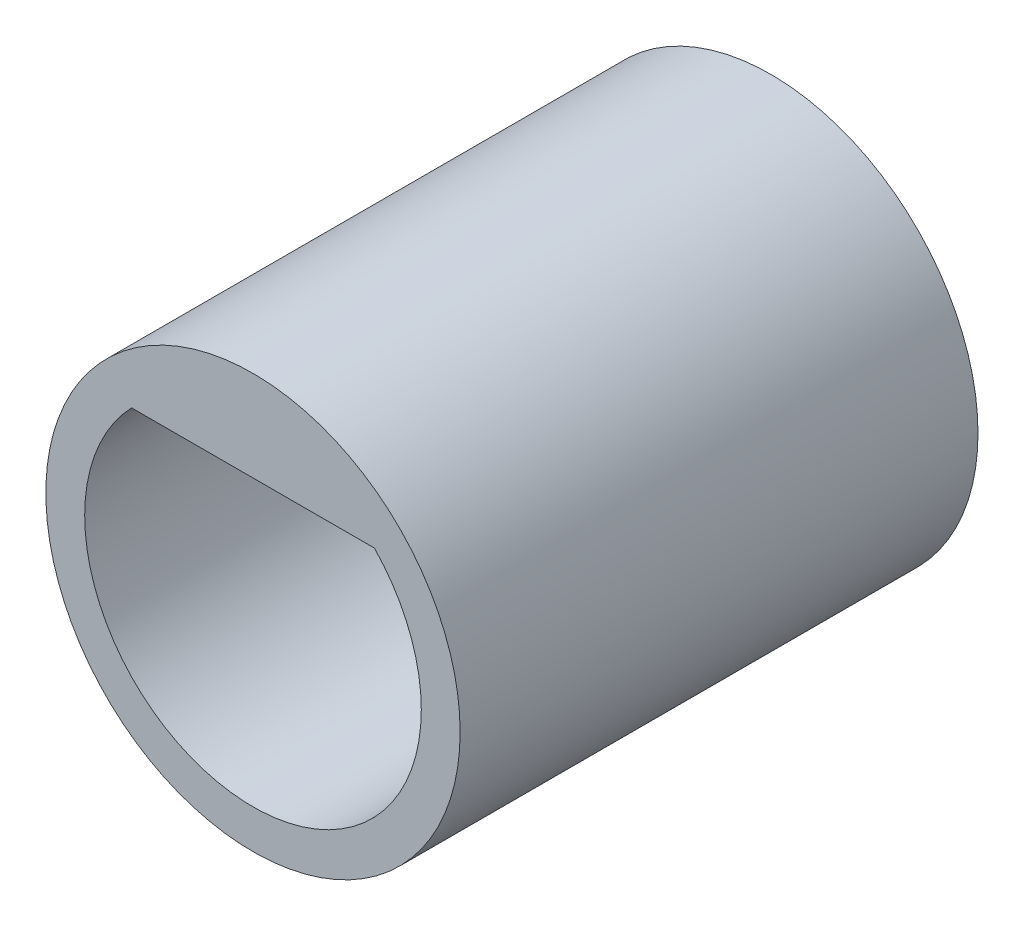
ISO-10303-21;
HEADER;
FILE_DESCRIPTION(('STEP AP214'),'2;1');
FILE_NAME('part.step','',(''),(''),'','','');
FILE_SCHEMA(('AUTOMOTIVE_DESIGN { 1 0 10303 214 1 1 1 1 }'));
ENDSEC;
DATA;
#1=APPLICATION_CONTEXT('core data for automotive mechanical design processes');
#2=APPLICATION_PROTOCOL_DEFINITION('international standard','automotive_design',2000,#1);
#3=PRODUCT_CONTEXT('',#1,'mechanical');
#4=PRODUCT('Part','Part','',(#3));
#5=PRODUCT_RELATED_PRODUCT_CATEGORY('part','',(#4));
#6=PRODUCT_DEFINITION_FORMATION('','',#4);
#7=PRODUCT_DEFINITION_CONTEXT('part definition',#1,'design');
#8=PRODUCT_DEFINITION('design','',#6,#7);
#9=PRODUCT_DEFINITION_SHAPE('','',#8);
#10=(LENGTH_UNIT() NAMED_UNIT(*) SI_UNIT(.MILLI.,.METRE.));
#11=(NAMED_UNIT(*) PLANE_ANGLE_UNIT() SI_UNIT($,.RADIAN.));
#12=(NAMED_UNIT(*) SI_UNIT($,.STERADIAN.) SOLID_ANGLE_UNIT());
#13=UNCERTAINTY_MEASURE_WITH_UNIT(LENGTH_MEASURE(1.E-05),#10,'distance_accuracy_value','');
#14=(GEOMETRIC_REPRESENTATION_CONTEXT(3) GLOBAL_UNCERTAINTY_ASSIGNED_CONTEXT((#13)) GLOBAL_UNIT_ASSIGNED_CONTEXT((#10,
#11,#12)) REPRESENTATION_CONTEXT('',''));
#15=CARTESIAN_POINT('',(0.,0.,0.));
#16=DIRECTION('',(0.,0.,1.));
#17=DIRECTION('',(1.,0.,0.));
#18=AXIS2_PLACEMENT_3D('',#15,#16,#17);
#19=CARTESIAN_POINT('',(0.,1.125,5.));
#20=DIRECTION('',(0.,1.,0.));
#21=DIRECTION('',(0.,0.,1.));
#22=AXIS2_PLACEMENT_3D('',#19,#20,#21);
#23=PLANE('',#22);
#24=DIRECTION('',(1.,0.,0.));
#25=VECTOR('',#24,1.);
#26=CARTESIAN_POINT('',(0.,1.125,0.));
#27=LINE('',#26,#25);
#28=CARTESIAN_POINT('',(-1.17260393995586,1.125,0.));
#29=VERTEX_POINT('',#28);
#30=CARTESIAN_POINT('',(1.17260393995586,1.125,0.));
#31=VERTEX_POINT('',#30);
#32=EDGE_CURVE('E60',#29,#31,#27,.T.);
#33=ORIENTED_EDGE('',*,*,#32,.T.);
#34=DIRECTION('',(0.,0.,-1.));
#35=VECTOR('',#34,1.);
#36=CARTESIAN_POINT('',(1.17260393995586,1.125,5.));
#37=LINE('',#36,#35);
#38=CARTESIAN_POINT('',(1.17260393995586,1.125,5.));
#39=VERTEX_POINT('',#38);
#40=EDGE_CURVE('E11',#39,#31,#37,.T.);
#41=ORIENTED_EDGE('',*,*,#40,.F.);
#42=DIRECTION('',(1.,0.,0.));
#43=VECTOR('',#42,1.);
#44=CARTESIAN_POINT('',(0.,1.125,5.));
#45=LINE('',#44,#43);
#46=CARTESIAN_POINT('',(-1.17260393995586,1.125,5.));
#47=VERTEX_POINT('',#46);
#48=EDGE_CURVE('E62',#47,#39,#45,.T.);
#49=ORIENTED_EDGE('',*,*,#48,.F.);
#50=DIRECTION('',(0.,0.,-1.));
#51=VECTOR('',#50,1.);
#52=CARTESIAN_POINT('',(-1.17260393995586,1.125,5.));
#53=LINE('',#52,#51);
#54=EDGE_CURVE('E44',#47,#29,#53,.T.);
#55=ORIENTED_EDGE('',*,*,#54,.T.);
#56=EDGE_LOOP('',(#33,#41,#49,#55));
#57=FACE_BOUND('',#56,.T.);
#58=ADVANCED_FACE('F36',(#57),#23,.F.);
#59=CARTESIAN_POINT('',(0.,0.,5.));
#60=DIRECTION('',(0.,0.,-1.));
#61=DIRECTION('',(-1.,0.,0.));
#62=AXIS2_PLACEMENT_3D('',#59,#60,#61);
#63=CYLINDRICAL_SURFACE('',#62,1.625);
#64=CARTESIAN_POINT('',(0.,0.,0.));
#65=DIRECTION('',(0.,0.,1.));
#66=DIRECTION('',(1.,0.,0.));
#67=AXIS2_PLACEMENT_3D('',#64,#65,#66);
#68=CIRCLE('',#67,1.625);
#69=EDGE_CURVE('E68',#29,#31,#68,.T.);
#70=ORIENTED_EDGE('',*,*,#69,.F.);
#71=ORIENTED_EDGE('',*,*,#54,.F.);
#72=CARTESIAN_POINT('',(0.,0.,5.));
#73=DIRECTION('',(0.,0.,1.));
#74=DIRECTION('',(1.,0.,0.));
#75=AXIS2_PLACEMENT_3D('',#72,#73,#74);
#76=CIRCLE('',#75,1.625);
#77=EDGE_CURVE('E78',#47,#39,#76,.T.);
#78=ORIENTED_EDGE('',*,*,#77,.T.);
#79=ORIENTED_EDGE('',*,*,#40,.T.);
#80=EDGE_LOOP('',(#70,#71,#78,#79));
#81=FACE_BOUND('',#80,.T.);
#82=ADVANCED_FACE('F70',(#81),#63,.F.);
#83=CARTESIAN_POINT('',(0.,0.,5.));
#84=DIRECTION('',(0.,0.,-1.));
#85=DIRECTION('',(-1.,0.,0.));
#86=AXIS2_PLACEMENT_3D('',#83,#84,#85);
#87=CYLINDRICAL_SURFACE('',#86,2.);
#88=CARTESIAN_POINT('',(0.,0.,5.));
#89=DIRECTION('',(0.,0.,1.));
#90=DIRECTION('',(1.,0.,0.));
#91=AXIS2_PLACEMENT_3D('',#88,#89,#90);
#92=CIRCLE('',#91,2.);
#93=CARTESIAN_POINT('',(2.,0.,5.));
#94=VERTEX_POINT('',#93);
#95=EDGE_CURVE('E64',#94,#94,#92,.T.);
#96=ORIENTED_EDGE('',*,*,#95,.F.);
#97=EDGE_LOOP('',(#96));
#98=FACE_BOUND('',#97,.T.);
#99=CARTESIAN_POINT('',(0.,0.,0.));
#100=DIRECTION('',(0.,0.,1.));
#101=DIRECTION('',(1.,0.,0.));
#102=AXIS2_PLACEMENT_3D('',#99,#100,#101);
#103=CIRCLE('',#102,2.);
#104=CARTESIAN_POINT('',(2.,0.,0.));
#105=VERTEX_POINT('',#104);
#106=EDGE_CURVE('E71',#105,#105,#103,.T.);
#107=ORIENTED_EDGE('',*,*,#106,.T.);
#108=EDGE_LOOP('',(#107));
#109=FACE_BOUND('',#108,.T.);
#110=ADVANCED_FACE('F84',(#98,#109),#87,.T.);
#111=CARTESIAN_POINT('',(0.,0.,5.));
#112=DIRECTION('',(0.,0.,1.));
#113=DIRECTION('',(1.,0.,0.));
#114=AXIS2_PLACEMENT_3D('',#111,#112,#113);
#115=PLANE('',#114);
#116=ORIENTED_EDGE('',*,*,#48,.T.);
#117=ORIENTED_EDGE('',*,*,#77,.F.);
#118=EDGE_LOOP('',(#116,#117));
#119=FACE_BOUND('',#118,.T.);
#120=ORIENTED_EDGE('',*,*,#95,.T.);
#121=EDGE_LOOP('',(#120));
#122=FACE_BOUND('',#121,.T.);
#123=ADVANCED_FACE('F81',(#119,#122),#115,.T.);
#124=CARTESIAN_POINT('',(0.,0.,0.));
#125=DIRECTION('',(0.,0.,1.));
#126=DIRECTION('',(1.,0.,0.));
#127=AXIS2_PLACEMENT_3D('',#124,#125,#126);
#128=PLANE('',#127);
#129=ORIENTED_EDGE('',*,*,#32,.F.);
#130=ORIENTED_EDGE('',*,*,#69,.T.);
#131=EDGE_LOOP('',(#129,#130));
#132=FACE_BOUND('',#131,.T.);
#133=ORIENTED_EDGE('',*,*,#106,.F.);
#134=EDGE_LOOP('',(#133));
#135=FACE_BOUND('',#134,.T.);
#136=ADVANCED_FACE('F66',(#132,#135),#128,.F.);
#137=CLOSED_SHELL('',(#58,#82,#110,#123,#136));
#138=MANIFOLD_SOLID_BREP('B2',#137);
#139=ADVANCED_BREP_SHAPE_REPRESENTATION('',(#18,#138),#14);
#140=SHAPE_DEFINITION_REPRESENTATION(#9,#139);
ENDSEC;
END-ISO-10303-21;
